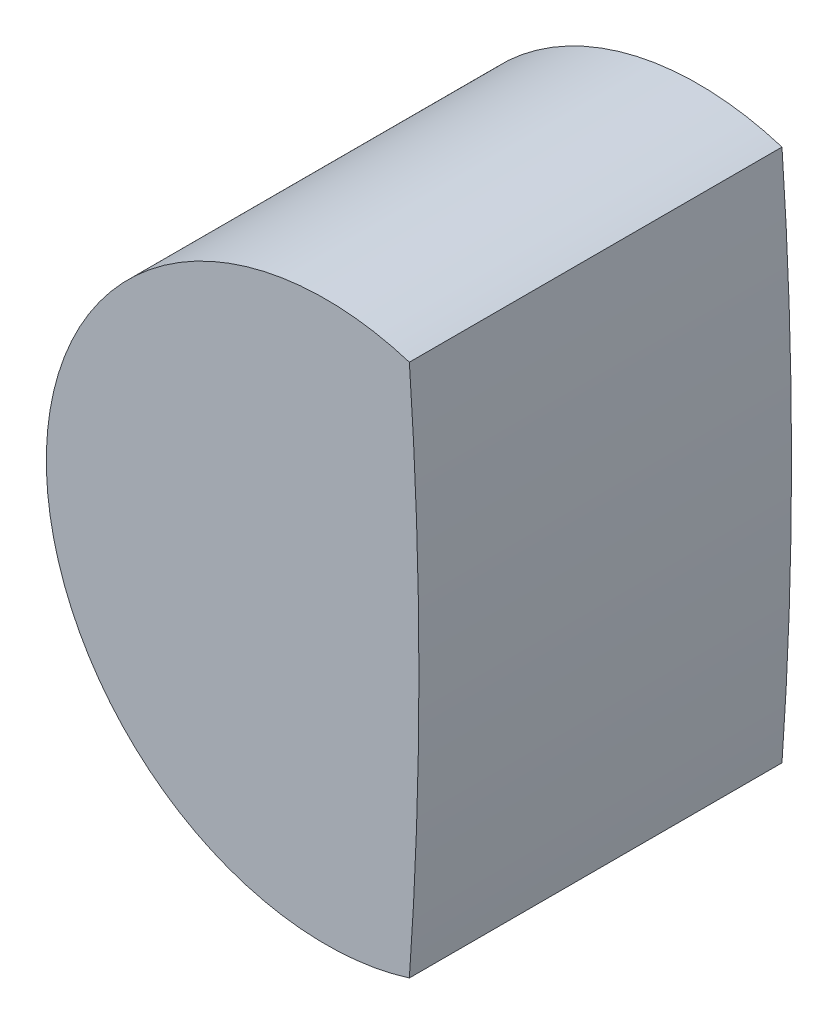
ISO-10303-21;
HEADER;
FILE_DESCRIPTION(('STEP AP214'),'2;1');
FILE_NAME('part.step','',(''),(''),'','','');
FILE_SCHEMA(('AUTOMOTIVE_DESIGN { 1 0 10303 214 1 1 1 1 }'));
ENDSEC;
DATA;
#1=APPLICATION_CONTEXT('core data for automotive mechanical design processes');
#2=APPLICATION_PROTOCOL_DEFINITION('international standard','automotive_design',2000,#1);
#3=PRODUCT_CONTEXT('',#1,'mechanical');
#4=PRODUCT('Part','Part','',(#3));
#5=PRODUCT_RELATED_PRODUCT_CATEGORY('part','',(#4));
#6=PRODUCT_DEFINITION_FORMATION('','',#4);
#7=PRODUCT_DEFINITION_CONTEXT('part definition',#1,'design');
#8=PRODUCT_DEFINITION('design','',#6,#7);
#9=PRODUCT_DEFINITION_SHAPE('','',#8);
#10=(LENGTH_UNIT() NAMED_UNIT(*) SI_UNIT(.MILLI.,.METRE.));
#11=(NAMED_UNIT(*) PLANE_ANGLE_UNIT() SI_UNIT($,.RADIAN.));
#12=(NAMED_UNIT(*) SI_UNIT($,.STERADIAN.) SOLID_ANGLE_UNIT());
#13=UNCERTAINTY_MEASURE_WITH_UNIT(LENGTH_MEASURE(1.E-05),#10,'distance_accuracy_value','');
#14=(GEOMETRIC_REPRESENTATION_CONTEXT(3) GLOBAL_UNCERTAINTY_ASSIGNED_CONTEXT((#13)) GLOBAL_UNIT_ASSIGNED_CONTEXT((#10,
#11,#12)) REPRESENTATION_CONTEXT('',''));
#15=CARTESIAN_POINT('',(0.,0.,0.));
#16=DIRECTION('',(0.,0.,1.));
#17=DIRECTION('',(1.,0.,0.));
#18=AXIS2_PLACEMENT_3D('',#15,#16,#17);
#19=CARTESIAN_POINT('',(-19.5,0.,2.));
#20=DIRECTION('',(0.,0.,-1.));
#21=DIRECTION('',(-1.,0.,0.));
#22=AXIS2_PLACEMENT_3D('',#19,#20,#21);
#23=CYLINDRICAL_SURFACE('',#22,20.);
#24=CARTESIAN_POINT('',(-19.5,0.,0.));
#25=DIRECTION('',(0.,0.,1.));
#26=DIRECTION('',(1.,0.,0.));
#27=AXIS2_PLACEMENT_3D('',#24,#25,#26);
#28=CIRCLE('',#27,20.);
#29=CARTESIAN_POINT('',(0.448717948717953,-1.4313113576362,0.));
#30=VERTEX_POINT('',#29);
#31=CARTESIAN_POINT('',(0.448717948717953,1.4313113576362,0.));
#32=VERTEX_POINT('',#31);
#33=EDGE_CURVE('E67',#30,#32,#28,.T.);
#34=ORIENTED_EDGE('',*,*,#33,.T.);
#35=DIRECTION('',(0.,0.,-1.));
#36=VECTOR('',#35,1.);
#37=CARTESIAN_POINT('',(0.448717948717953,1.4313113576362,2.));
#38=LINE('',#37,#36);
#39=CARTESIAN_POINT('',(0.448717948717953,1.4313113576362,2.));
#40=VERTEX_POINT('',#39);
#41=EDGE_CURVE('E11',#40,#32,#38,.T.);
#42=ORIENTED_EDGE('',*,*,#41,.F.);
#43=CARTESIAN_POINT('',(-19.5,0.,2.));
#44=DIRECTION('',(0.,0.,1.));
#45=DIRECTION('',(1.,0.,0.));
#46=AXIS2_PLACEMENT_3D('',#43,#44,#45);
#47=CIRCLE('',#46,20.);
#48=CARTESIAN_POINT('',(0.448717948717953,-1.4313113576362,2.));
#49=VERTEX_POINT('',#48);
#50=EDGE_CURVE('E68',#49,#40,#47,.T.);
#51=ORIENTED_EDGE('',*,*,#50,.F.);
#52=DIRECTION('',(0.,0.,-1.));
#53=VECTOR('',#52,1.);
#54=CARTESIAN_POINT('',(0.448717948717953,-1.4313113576362,2.));
#55=LINE('',#54,#53);
#56=EDGE_CURVE('E50',#49,#30,#55,.T.);
#57=ORIENTED_EDGE('',*,*,#56,.T.);
#58=EDGE_LOOP('',(#34,#42,#51,#57));
#59=FACE_BOUND('',#58,.T.);
#60=ADVANCED_FACE('F39',(#59),#23,.T.);
#61=CARTESIAN_POINT('',(0.,0.,2.));
#62=DIRECTION('',(0.,0.,-1.));
#63=DIRECTION('',(-1.,0.,0.));
#64=AXIS2_PLACEMENT_3D('',#61,#62,#63);
#65=CYLINDRICAL_SURFACE('',#64,1.50000000000001);
#66=CARTESIAN_POINT('',(0.,0.,0.));
#67=DIRECTION('',(0.,0.,1.));
#68=DIRECTION('',(1.,0.,0.));
#69=AXIS2_PLACEMENT_3D('',#66,#67,#68);
#70=CIRCLE('',#69,1.50000000000001);
#71=EDGE_CURVE('E65',#32,#30,#70,.T.);
#72=ORIENTED_EDGE('',*,*,#71,.T.);
#73=ORIENTED_EDGE('',*,*,#56,.F.);
#74=CARTESIAN_POINT('',(0.,0.,2.));
#75=DIRECTION('',(0.,0.,1.));
#76=DIRECTION('',(1.,0.,0.));
#77=AXIS2_PLACEMENT_3D('',#74,#75,#76);
#78=CIRCLE('',#77,1.50000000000001);
#79=EDGE_CURVE('E53',#40,#49,#78,.T.);
#80=ORIENTED_EDGE('',*,*,#79,.F.);
#81=ORIENTED_EDGE('',*,*,#41,.T.);
#82=EDGE_LOOP('',(#72,#73,#80,#81));
#83=FACE_BOUND('',#82,.T.);
#84=ADVANCED_FACE('F63',(#83),#65,.T.);
#85=CARTESIAN_POINT('',(-9.75,0.,2.));
#86=DIRECTION('',(0.,0.,1.));
#87=DIRECTION('',(1.,0.,0.));
#88=AXIS2_PLACEMENT_3D('',#85,#86,#87);
#89=PLANE('',#88);
#90=ORIENTED_EDGE('',*,*,#50,.T.);
#91=ORIENTED_EDGE('',*,*,#79,.T.);
#92=EDGE_LOOP('',(#90,#91));
#93=FACE_BOUND('',#92,.T.);
#94=ADVANCED_FACE('F80',(#93),#89,.T.);
#95=CARTESIAN_POINT('',(-9.75,0.,0.));
#96=DIRECTION('',(0.,0.,1.));
#97=DIRECTION('',(1.,0.,0.));
#98=AXIS2_PLACEMENT_3D('',#95,#96,#97);
#99=PLANE('',#98);
#100=ORIENTED_EDGE('',*,*,#33,.F.);
#101=ORIENTED_EDGE('',*,*,#71,.F.);
#102=EDGE_LOOP('',(#100,#101));
#103=FACE_BOUND('',#102,.T.);
#104=ADVANCED_FACE('F71',(#103),#99,.F.);
#105=CLOSED_SHELL('',(#60,#84,#94,#104));
#106=MANIFOLD_SOLID_BREP('B2',#105);
#107=ADVANCED_BREP_SHAPE_REPRESENTATION('',(#18,#106),#14);
#108=SHAPE_DEFINITION_REPRESENTATION(#9,#107);
ENDSEC;
END-ISO-10303-21;
